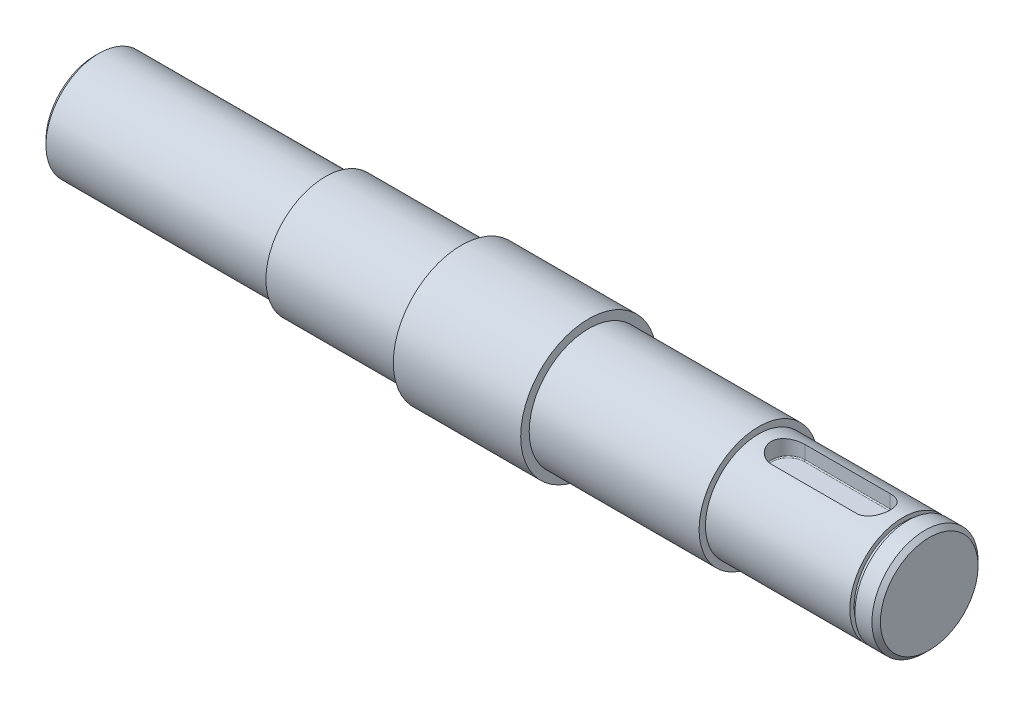
ISO-10303-21;
HEADER;
FILE_DESCRIPTION(('STEP AP214'),'2;1');
FILE_NAME('part.step','',(''),(''),'','','');
FILE_SCHEMA(('AUTOMOTIVE_DESIGN { 1 0 10303 214 1 1 1 1 }'));
ENDSEC;
DATA;
#1=APPLICATION_CONTEXT('core data for automotive mechanical design processes');
#2=APPLICATION_PROTOCOL_DEFINITION('international standard','automotive_design',2000,#1);
#3=PRODUCT_CONTEXT('',#1,'mechanical');
#4=PRODUCT('Part','Part','',(#3));
#5=PRODUCT_RELATED_PRODUCT_CATEGORY('part','',(#4));
#6=PRODUCT_DEFINITION_FORMATION('','',#4);
#7=PRODUCT_DEFINITION_CONTEXT('part definition',#1,'design');
#8=PRODUCT_DEFINITION('design','',#6,#7);
#9=PRODUCT_DEFINITION_SHAPE('','',#8);
#10=(LENGTH_UNIT() NAMED_UNIT(*) SI_UNIT(.MILLI.,.METRE.));
#11=(NAMED_UNIT(*) PLANE_ANGLE_UNIT() SI_UNIT($,.RADIAN.));
#12=(NAMED_UNIT(*) SI_UNIT($,.STERADIAN.) SOLID_ANGLE_UNIT());
#13=UNCERTAINTY_MEASURE_WITH_UNIT(LENGTH_MEASURE(1.E-05),#10,'distance_accuracy_value','');
#14=(GEOMETRIC_REPRESENTATION_CONTEXT(3) GLOBAL_UNCERTAINTY_ASSIGNED_CONTEXT((#13)) GLOBAL_UNIT_ASSIGNED_CONTEXT((#10,
#11,#12)) REPRESENTATION_CONTEXT('',''));
#15=CARTESIAN_POINT('',(0.,0.,0.));
#16=DIRECTION('',(0.,0.,1.));
#17=DIRECTION('',(1.,0.,0.));
#18=AXIS2_PLACEMENT_3D('',#15,#16,#17);
#19=CARTESIAN_POINT('',(196.,0.,0.));
#20=DIRECTION('',(-1.,0.,0.));
#21=DIRECTION('',(0.,0.,-1.));
#22=AXIS2_PLACEMENT_3D('',#19,#20,#21);
#23=CONICAL_SURFACE('',#22,12.,0.785398163397448);
#24=CARTESIAN_POINT('',(196.5,0.,0.));
#25=DIRECTION('',(1.,0.,0.));
#26=DIRECTION('',(0.,0.,1.));
#27=AXIS2_PLACEMENT_3D('',#24,#25,#26);
#28=CIRCLE('',#27,11.5);
#29=CARTESIAN_POINT('',(196.5,0.,11.5));
#30=VERTEX_POINT('',#29);
#31=EDGE_CURVE('E261',#30,#30,#28,.T.);
#32=ORIENTED_EDGE('',*,*,#31,.F.);
#33=EDGE_LOOP('',(#32));
#34=FACE_BOUND('',#33,.T.);
#35=CARTESIAN_POINT('',(195.5,0.,0.));
#36=DIRECTION('',(1.,0.,0.));
#37=DIRECTION('',(0.,0.,1.));
#38=AXIS2_PLACEMENT_3D('',#35,#36,#37);
#39=CIRCLE('',#38,12.5);
#40=CARTESIAN_POINT('',(195.5,0.,12.5));
#41=VERTEX_POINT('',#40);
#42=EDGE_CURVE('E255',#41,#41,#39,.T.);
#43=ORIENTED_EDGE('',*,*,#42,.T.);
#44=EDGE_LOOP('',(#43));
#45=FACE_BOUND('',#44,.T.);
#46=ADVANCED_FACE('F16',(#34,#45),#23,.T.);
#47=CARTESIAN_POINT('',(0.,0.,0.));
#48=DIRECTION('',(-1.,0.,0.));
#49=DIRECTION('',(0.,1.,0.));
#50=AXIS2_PLACEMENT_3D('',#47,#48,#49);
#51=PLANE('',#50);
#52=CARTESIAN_POINT('',(0.,0.,0.));
#53=DIRECTION('',(-1.,0.,0.));
#54=DIRECTION('',(0.,0.,-1.));
#55=AXIS2_PLACEMENT_3D('',#52,#53,#54);
#56=CIRCLE('',#55,11.5);
#57=CARTESIAN_POINT('',(0.,0.,-11.5));
#58=VERTEX_POINT('',#57);
#59=EDGE_CURVE('E10',#58,#58,#56,.T.);
#60=ORIENTED_EDGE('',*,*,#59,.T.);
#61=EDGE_LOOP('',(#60));
#62=FACE_BOUND('',#61,.T.);
#63=ADVANCED_FACE('F479',(#62),#51,.T.);
#64=CARTESIAN_POINT('',(0.5,0.,0.));
#65=DIRECTION('',(1.,0.,0.));
#66=DIRECTION('',(0.,0.,1.));
#67=AXIS2_PLACEMENT_3D('',#64,#65,#66);
#68=CONICAL_SURFACE('',#67,12.,0.785398163397448);
#69=CARTESIAN_POINT('',(1.,0.,0.));
#70=DIRECTION('',(-1.,0.,0.));
#71=DIRECTION('',(0.,0.,-1.));
#72=AXIS2_PLACEMENT_3D('',#69,#70,#71);
#73=CIRCLE('',#72,12.5);
#74=CARTESIAN_POINT('',(1.,0.,-12.5));
#75=VERTEX_POINT('',#74);
#76=EDGE_CURVE('E24',#75,#75,#73,.T.);
#77=ORIENTED_EDGE('',*,*,#76,.T.);
#78=EDGE_LOOP('',(#77));
#79=FACE_BOUND('',#78,.T.);
#80=ORIENTED_EDGE('',*,*,#59,.F.);
#81=EDGE_LOOP('',(#80));
#82=FACE_BOUND('',#81,.T.);
#83=ADVANCED_FACE('F470',(#79,#82),#68,.T.);
#84=CARTESIAN_POINT('',(54.3,0.,0.));
#85=DIRECTION('',(-1.,0.,0.));
#86=DIRECTION('',(0.,0.,-1.));
#87=AXIS2_PLACEMENT_3D('',#84,#85,#86);
#88=CYLINDRICAL_SURFACE('',#87,12.5);
#89=CARTESIAN_POINT('',(54.3,0.,0.));
#90=DIRECTION('',(1.,0.,0.));
#91=DIRECTION('',(0.,0.,-1.));
#92=AXIS2_PLACEMENT_3D('',#89,#90,#91);
#93=CIRCLE('',#92,12.5);
#94=CARTESIAN_POINT('',(54.3,0.,-12.5));
#95=VERTEX_POINT('',#94);
#96=EDGE_CURVE('E208',#95,#95,#93,.T.);
#97=ORIENTED_EDGE('',*,*,#96,.F.);
#98=EDGE_LOOP('',(#97));
#99=FACE_BOUND('',#98,.T.);
#100=ORIENTED_EDGE('',*,*,#76,.F.);
#101=EDGE_LOOP('',(#100));
#102=FACE_BOUND('',#101,.T.);
#103=ADVANCED_FACE('F461',(#99,#102),#88,.T.);
#104=CARTESIAN_POINT('',(54.3,0.,0.));
#105=DIRECTION('',(1.,0.,0.));
#106=DIRECTION('',(0.,0.,-1.));
#107=AXIS2_PLACEMENT_3D('',#104,#105,#106);
#108=PLANE('',#107);
#109=ORIENTED_EDGE('',*,*,#96,.T.);
#110=EDGE_LOOP('',(#109));
#111=FACE_BOUND('',#110,.T.);
#112=CARTESIAN_POINT('',(54.3,0.,0.));
#113=DIRECTION('',(1.,0.,0.));
#114=DIRECTION('',(0.,0.,1.));
#115=AXIS2_PLACEMENT_3D('',#112,#113,#114);
#116=CIRCLE('',#115,14.);
#117=CARTESIAN_POINT('',(54.3,0.,14.));
#118=VERTEX_POINT('',#117);
#119=EDGE_CURVE('E211',#118,#118,#116,.T.);
#120=ORIENTED_EDGE('',*,*,#119,.F.);
#121=EDGE_LOOP('',(#120));
#122=FACE_BOUND('',#121,.T.);
#123=ADVANCED_FACE('F452',(#111,#122),#108,.F.);
#124=CARTESIAN_POINT('',(54.3,0.,0.));
#125=DIRECTION('',(1.,0.,0.));
#126=DIRECTION('',(0.,0.,1.));
#127=AXIS2_PLACEMENT_3D('',#124,#125,#126);
#128=CYLINDRICAL_SURFACE('',#127,14.);
#129=CARTESIAN_POINT('',(86.3,0.,0.));
#130=DIRECTION('',(1.,0.,0.));
#131=DIRECTION('',(0.,0.,1.));
#132=AXIS2_PLACEMENT_3D('',#129,#130,#131);
#133=CIRCLE('',#132,14.);
#134=CARTESIAN_POINT('',(86.3,0.,14.));
#135=VERTEX_POINT('',#134);
#136=EDGE_CURVE('E258',#135,#135,#133,.T.);
#137=ORIENTED_EDGE('',*,*,#136,.F.);
#138=EDGE_LOOP('',(#137));
#139=FACE_BOUND('',#138,.T.);
#140=ORIENTED_EDGE('',*,*,#119,.T.);
#141=EDGE_LOOP('',(#140));
#142=FACE_BOUND('',#141,.T.);
#143=ADVANCED_FACE('F443',(#139,#142),#128,.T.);
#144=CARTESIAN_POINT('',(196.5,0.,0.));
#145=DIRECTION('',(1.,0.,0.));
#146=DIRECTION('',(0.,0.,-1.));
#147=AXIS2_PLACEMENT_3D('',#144,#145,#146);
#148=PLANE('',#147);
#149=ORIENTED_EDGE('',*,*,#31,.T.);
#150=EDGE_LOOP('',(#149));
#151=FACE_BOUND('',#150,.T.);
#152=ADVANCED_FACE('F434',(#151),#148,.T.);
#153=CARTESIAN_POINT('',(86.3,0.,0.));
#154=DIRECTION('',(1.,0.,0.));
#155=DIRECTION('',(0.,0.,-1.));
#156=AXIS2_PLACEMENT_3D('',#153,#154,#155);
#157=PLANE('',#156);
#158=ORIENTED_EDGE('',*,*,#136,.T.);
#159=EDGE_LOOP('',(#158));
#160=FACE_BOUND('',#159,.T.);
#161=CARTESIAN_POINT('',(86.3,0.,0.));
#162=DIRECTION('',(1.,0.,0.));
#163=DIRECTION('',(0.,0.,1.));
#164=AXIS2_PLACEMENT_3D('',#161,#162,#163);
#165=CIRCLE('',#164,16.);
#166=CARTESIAN_POINT('',(86.3,0.,16.));
#167=VERTEX_POINT('',#166);
#168=EDGE_CURVE('E252',#167,#167,#165,.T.);
#169=ORIENTED_EDGE('',*,*,#168,.F.);
#170=EDGE_LOOP('',(#169));
#171=FACE_BOUND('',#170,.T.);
#172=ADVANCED_FACE('F425',(#160,#171),#157,.F.);
#173=CARTESIAN_POINT('',(191.5,0.,0.));
#174=DIRECTION('',(1.,0.,0.));
#175=DIRECTION('',(0.,0.,1.));
#176=AXIS2_PLACEMENT_3D('',#173,#174,#175);
#177=CYLINDRICAL_SURFACE('',#176,12.5);
#178=ORIENTED_EDGE('',*,*,#42,.F.);
#179=EDGE_LOOP('',(#178));
#180=FACE_BOUND('',#179,.T.);
#181=CARTESIAN_POINT('',(191.5,0.,0.));
#182=DIRECTION('',(1.,0.,0.));
#183=DIRECTION('',(0.,0.,1.));
#184=AXIS2_PLACEMENT_3D('',#181,#182,#183);
#185=CIRCLE('',#184,12.5);
#186=CARTESIAN_POINT('',(191.5,0.,12.5));
#187=VERTEX_POINT('',#186);
#188=EDGE_CURVE('E249',#187,#187,#185,.T.);
#189=ORIENTED_EDGE('',*,*,#188,.T.);
#190=EDGE_LOOP('',(#189));
#191=FACE_BOUND('',#190,.T.);
#192=ADVANCED_FACE('F416',(#180,#191),#177,.T.);
#193=CARTESIAN_POINT('',(86.3,0.,0.));
#194=DIRECTION('',(1.,0.,0.));
#195=DIRECTION('',(0.,0.,1.));
#196=AXIS2_PLACEMENT_3D('',#193,#194,#195);
#197=CYLINDRICAL_SURFACE('',#196,16.);
#198=CARTESIAN_POINT('',(116.3,0.,0.));
#199=DIRECTION('',(1.,0.,0.));
#200=DIRECTION('',(0.,0.,1.));
#201=AXIS2_PLACEMENT_3D('',#198,#199,#200);
#202=CIRCLE('',#201,16.);
#203=CARTESIAN_POINT('',(116.3,0.,16.));
#204=VERTEX_POINT('',#203);
#205=EDGE_CURVE('E246',#204,#204,#202,.T.);
#206=ORIENTED_EDGE('',*,*,#205,.F.);
#207=EDGE_LOOP('',(#206));
#208=FACE_BOUND('',#207,.T.);
#209=ORIENTED_EDGE('',*,*,#168,.T.);
#210=EDGE_LOOP('',(#209));
#211=FACE_BOUND('',#210,.T.);
#212=ADVANCED_FACE('F407',(#208,#211),#197,.T.);
#213=CARTESIAN_POINT('',(191.5,0.,0.));
#214=DIRECTION('',(1.,0.,0.));
#215=DIRECTION('',(0.,0.,-1.));
#216=AXIS2_PLACEMENT_3D('',#213,#214,#215);
#217=PLANE('',#216);
#218=CARTESIAN_POINT('',(191.5,0.,0.));
#219=DIRECTION('',(1.,0.,0.));
#220=DIRECTION('',(0.,0.,1.));
#221=AXIS2_PLACEMENT_3D('',#218,#219,#220);
#222=CIRCLE('',#221,11.5);
#223=CARTESIAN_POINT('',(191.5,0.,11.5));
#224=VERTEX_POINT('',#223);
#225=EDGE_CURVE('E225',#224,#224,#222,.T.);
#226=ORIENTED_EDGE('',*,*,#225,.T.);
#227=EDGE_LOOP('',(#226));
#228=FACE_BOUND('',#227,.T.);
#229=ORIENTED_EDGE('',*,*,#188,.F.);
#230=EDGE_LOOP('',(#229));
#231=FACE_BOUND('',#230,.T.);
#232=ADVANCED_FACE('F398',(#228,#231),#217,.F.);
#233=CARTESIAN_POINT('',(116.3,0.,0.));
#234=DIRECTION('',(1.,0.,0.));
#235=DIRECTION('',(0.,0.,-1.));
#236=AXIS2_PLACEMENT_3D('',#233,#234,#235);
#237=PLANE('',#236);
#238=CARTESIAN_POINT('',(116.3,0.,0.));
#239=DIRECTION('',(1.,0.,0.));
#240=DIRECTION('',(0.,0.,1.));
#241=AXIS2_PLACEMENT_3D('',#238,#239,#240);
#242=CIRCLE('',#241,14.);
#243=CARTESIAN_POINT('',(116.3,0.,14.));
#244=VERTEX_POINT('',#243);
#245=EDGE_CURVE('E222',#244,#244,#242,.T.);
#246=ORIENTED_EDGE('',*,*,#245,.F.);
#247=EDGE_LOOP('',(#246));
#248=FACE_BOUND('',#247,.T.);
#249=ORIENTED_EDGE('',*,*,#205,.T.);
#250=EDGE_LOOP('',(#249));
#251=FACE_BOUND('',#250,.T.);
#252=ADVANCED_FACE('F360',(#248,#251),#237,.T.);
#253=CARTESIAN_POINT('',(190.3,0.,0.));
#254=DIRECTION('',(1.,0.,0.));
#255=DIRECTION('',(0.,0.,1.));
#256=AXIS2_PLACEMENT_3D('',#253,#254,#255);
#257=CYLINDRICAL_SURFACE('',#256,11.5);
#258=ORIENTED_EDGE('',*,*,#225,.F.);
#259=EDGE_LOOP('',(#258));
#260=FACE_BOUND('',#259,.T.);
#261=CARTESIAN_POINT('',(190.3,0.,0.));
#262=DIRECTION('',(1.,0.,0.));
#263=DIRECTION('',(0.,0.,1.));
#264=AXIS2_PLACEMENT_3D('',#261,#262,#263);
#265=CIRCLE('',#264,11.5);
#266=CARTESIAN_POINT('',(190.3,0.,11.5));
#267=VERTEX_POINT('',#266);
#268=EDGE_CURVE('E226',#267,#267,#265,.T.);
#269=ORIENTED_EDGE('',*,*,#268,.T.);
#270=EDGE_LOOP('',(#269));
#271=FACE_BOUND('',#270,.T.);
#272=ADVANCED_FACE('F355',(#260,#271),#257,.T.);
#273=CARTESIAN_POINT('',(116.3,0.,0.));
#274=DIRECTION('',(1.,0.,0.));
#275=DIRECTION('',(0.,0.,1.));
#276=AXIS2_PLACEMENT_3D('',#273,#274,#275);
#277=CYLINDRICAL_SURFACE('',#276,14.);
#278=CARTESIAN_POINT('',(156.3,0.,0.));
#279=DIRECTION('',(1.,0.,0.));
#280=DIRECTION('',(0.,0.,1.));
#281=AXIS2_PLACEMENT_3D('',#278,#279,#280);
#282=CIRCLE('',#281,14.);
#283=CARTESIAN_POINT('',(156.3,0.,14.));
#284=VERTEX_POINT('',#283);
#285=EDGE_CURVE('E239',#284,#284,#282,.T.);
#286=ORIENTED_EDGE('',*,*,#285,.F.);
#287=EDGE_LOOP('',(#286));
#288=FACE_BOUND('',#287,.T.);
#289=ORIENTED_EDGE('',*,*,#245,.T.);
#290=EDGE_LOOP('',(#289));
#291=FACE_BOUND('',#290,.T.);
#292=ADVANCED_FACE('F325',(#288,#291),#277,.T.);
#293=CARTESIAN_POINT('',(163.3,14.5,0.));
#294=DIRECTION('',(0.,-1.,0.));
#295=DIRECTION('',(0.,0.,1.));
#296=AXIS2_PLACEMENT_3D('',#293,#294,#295);
#297=CYLINDRICAL_SURFACE('',#296,4.);
#298=CARTESIAN_POINT('',(163.3,11.8427192858859,4.));
#299=CARTESIAN_POINT('',(163.284892466756,11.8427192752621,4.00000000660021));
#300=CARTESIAN_POINT('',(163.254212249326,11.842777996675,3.9998261785867));
#301=CARTESIAN_POINT('',(163.207493473476,11.8430489331777,3.99902392736785));
#302=CARTESIAN_POINT('',(163.158911811704,11.8435251742866,3.99761335533497));
#303=CARTESIAN_POINT('',(163.108471710308,11.8442304856701,3.99552329848311));
#304=CARTESIAN_POINT('',(163.05527085542,11.8452061140425,3.99263022749253));
#305=CARTESIAN_POINT('',(162.99934581795,11.8464881791008,3.98882498307457));
#306=CARTESIAN_POINT('',(162.939828209384,11.8481425176702,3.9839088861287));
#307=CARTESIAN_POINT('',(162.877693963482,11.8501895947723,3.97781640996389));
#308=CARTESIAN_POINT('',(162.812075378895,11.852703516797,3.97032039658099));
#309=CARTESIAN_POINT('',(162.742975027474,11.8557401898192,3.96124496184573));
#310=CARTESIAN_POINT('',(162.668550626589,11.8594588136524,3.95010022951008));
#311=CARTESIAN_POINT('',(162.589739078941,11.8639060675799,3.93672608047436));
#312=CARTESIAN_POINT('',(162.505724072297,11.8692217159966,3.92067426343487));
#313=CARTESIAN_POINT('',(162.417585169864,11.8754334863806,3.90182449436319));
#314=CARTESIAN_POINT('',(162.324583083993,11.8826955632336,3.87965910663391));
#315=CARTESIAN_POINT('',(162.228608353377,11.8909515068504,3.85428889686126));
#316=CARTESIAN_POINT('',(162.125416748823,11.9006688726898,3.82419473916238));
#317=CARTESIAN_POINT('',(162.011900864232,11.912361661601,3.78764494253445));
#318=CARTESIAN_POINT('',(161.879302537444,11.9273534219398,3.74022440541349));
#319=CARTESIAN_POINT('',(161.729407026826,11.9460589826312,3.68013140989384));
#320=CARTESIAN_POINT('',(161.53573252434,11.9727862259489,3.59251445457917));
#321=CARTESIAN_POINT('',(161.311825439645,12.0076032040654,3.47489008872733));
#322=CARTESIAN_POINT('',(161.06756852221,12.0505397477586,3.32320090947642));
#323=CARTESIAN_POINT('',(160.86480221771,12.0900539464116,3.17616924328629));
#324=CARTESIAN_POINT('',(160.70312435576,12.1238788743454,3.04399595699051));
#325=CARTESIAN_POINT('',(160.585170312725,12.149755874987,2.93888301933396));
#326=CARTESIAN_POINT('',(160.485427483789,12.1724811326278,2.84314557943963));
#327=CARTESIAN_POINT('',(160.402861414864,12.1918658532214,2.75874255753679));
#328=CARTESIAN_POINT('',(160.330041197925,12.2093900654748,2.68007073123343));
#329=CARTESIAN_POINT('',(160.263954147601,12.2256401500441,2.60493571203151));
#330=CARTESIAN_POINT('',(160.201272223952,12.241362703419,2.53001351594598));
#331=CARTESIAN_POINT('',(160.142160972386,12.256464343019,2.45580549797962));
#332=CARTESIAN_POINT('',(160.085936646302,12.2710746679386,2.38172496693647));
#333=CARTESIAN_POINT('',(160.032645351703,12.2851441846673,2.30805286206816));
#334=CARTESIAN_POINT('',(159.982022040378,12.2987085394487,2.23463703708557));
#335=CARTESIAN_POINT('',(159.929374890022,12.3130101564768,2.15457377825303));
#336=CARTESIAN_POINT('',(159.87519928686,12.3279464164696,2.06755670675723));
#337=CARTESIAN_POINT('',(159.820197819244,12.3433447429019,1.97353447948222));
#338=CARTESIAN_POINT('',(159.773289947215,12.3566627451695,1.88815769454465));
#339=CARTESIAN_POINT('',(159.733335175994,12.3681336116315,1.81131592893122));
#340=CARTESIAN_POINT('',(159.699404971463,12.3779622471653,1.74288428722177));
#341=CARTESIAN_POINT('',(159.6670400184,12.3874168001104,1.67436451945004));
#342=CARTESIAN_POINT('',(159.636263853849,12.3964788789652,1.60589579335905));
#343=CARTESIAN_POINT('',(159.606958149926,12.4051727267374,1.53729733703149));
#344=CARTESIAN_POINT('',(159.578020893908,12.4138179898951,1.46591893637077));
#345=CARTESIAN_POINT('',(159.548534751305,12.4226895624473,1.38888828448686));
#346=CARTESIAN_POINT('',(159.517007446065,12.4322449563189,1.30086299545673));
#347=CARTESIAN_POINT('',(159.484216202054,12.4422612968341,1.2016362301614));
#348=CARTESIAN_POINT('',(159.451137385848,12.4524464911315,1.0913230929822));
#349=CARTESIAN_POINT('',(159.420088320964,12.4620803817568,0.975334923046085));
#350=CARTESIAN_POINT('',(159.390477329963,12.4713320730924,0.849417097911197));
#351=CARTESIAN_POINT('',(159.36492992649,12.4793672187247,0.721954193939012));
#352=CARTESIAN_POINT('',(159.344544940332,12.4858134897378,0.599010476986652));
#353=CARTESIAN_POINT('',(159.331277917536,12.490024945918,0.501697218336813));
#354=CARTESIAN_POINT('',(159.322421245672,12.4928427174447,0.424518080983753));
#355=CARTESIAN_POINT('',(159.316261344746,12.4948054939283,0.362091034234707));
#356=CARTESIAN_POINT('',(159.31118806648,12.4964240692941,0.300991135102319));
#357=CARTESIAN_POINT('',(159.307146176634,12.4977149076161,0.241415904567368));
#358=CARTESIAN_POINT('',(159.304036851482,12.4987087096093,0.182774470852502));
#359=CARTESIAN_POINT('',(159.301745996088,12.4994413495439,0.123193172201231));
#360=CARTESIAN_POINT('',(159.300323111578,12.4998965988717,0.0622971889286505));
#361=CARTESIAN_POINT('',(159.299986632885,12.5000042774489,0.0190073821308843));
#362=CARTESIAN_POINT('',(159.300017627936,12.4999943591438,-0.0290538366999472));
#363=CARTESIAN_POINT('',(159.300611377066,12.499804345621,-0.0835474518488583));
#364=CARTESIAN_POINT('',(159.303398555554,12.4989127082237,-0.174349819962573));
#365=CARTESIAN_POINT('',(159.308983654857,12.4971274309324,-0.27552682237082));
#366=CARTESIAN_POINT('',(159.317954345777,12.4942649647029,-0.383415945096935));
#367=CARTESIAN_POINT('',(159.327920947617,12.4910920373344,-0.474259392613105));
#368=CARTESIAN_POINT('',(159.337635040539,12.4880068363431,-0.54855802561309));
#369=CARTESIAN_POINT('',(159.346197166626,12.4852927227441,-0.607060230835405));
#370=CARTESIAN_POINT('',(159.355156785202,12.4824582116473,-0.662740582128897));
#371=CARTESIAN_POINT('',(159.364915144854,12.4793774301058,-0.718476246994006));
#372=CARTESIAN_POINT('',(159.375979294695,12.4758926034321,-0.776731340873855));
#373=CARTESIAN_POINT('',(159.388867442942,12.4718443075685,-0.839345925495779));
#374=CARTESIAN_POINT('',(159.403709353992,12.4671971144693,-0.905862854158762));
#375=CARTESIAN_POINT('',(159.423457094917,12.4610366875257,-0.987542528589665));
#376=CARTESIAN_POINT('',(159.449260674908,12.4530279731438,-1.08451458418038));
#377=CARTESIAN_POINT('',(159.48294090577,12.4426500050685,-1.19792983905691));
#378=CARTESIAN_POINT('',(159.519114355269,12.4315996300285,-1.30737731502847));
#379=CARTESIAN_POINT('',(159.556837683888,12.4201797272635,-1.41148031393508));
#380=CARTESIAN_POINT('',(159.595089726379,12.4087014317319,-1.50911343603032));
#381=CARTESIAN_POINT('',(159.636923132369,12.3962716499521,-1.60804660624065));
#382=CARTESIAN_POINT('',(159.682064323075,12.3830043603179,-1.70719517092053));
#383=CARTESIAN_POINT('',(159.729888888516,12.3691130187255,-1.80506312765269));
#384=CARTESIAN_POINT('',(159.779863543443,12.3547790658151,-1.90064962239504));
#385=CARTESIAN_POINT('',(159.831577106813,12.3401424105648,-1.99342055947352));
#386=CARTESIAN_POINT('',(159.889726890639,12.3239115833508,-2.09158124031287));
#387=CARTESIAN_POINT('',(159.954775769275,12.3060532753542,-2.19434103684966));
#388=CARTESIAN_POINT('',(160.027005734775,12.2866124148119,-2.30062232253015));
#389=CARTESIAN_POINT('',(160.094685734212,12.26876963804,-2.39372226197031));
#390=CARTESIAN_POINT('',(160.157357183993,12.2525589515004,-2.47519705833708));
#391=CARTESIAN_POINT('',(160.215014569743,12.237894747636,-2.54669935387715));
#392=CARTESIAN_POINT('',(160.274510026335,12.2230292834304,-2.61710914779064));
#393=CARTESIAN_POINT('',(160.343780509586,12.2060432322161,-2.69534519365332));
#394=CARTESIAN_POINT('',(160.424209921782,12.1867795149854,-2.78127234019984));
#395=CARTESIAN_POINT('',(160.517350495478,12.1651238647946,-2.87450762856061));
#396=CARTESIAN_POINT('',(160.610899040896,12.1440714915068,-2.96210544028574));
#397=CARTESIAN_POINT('',(160.707217859563,12.1231040920882,-3.04674852974405));
#398=CARTESIAN_POINT('',(160.81249271574,12.1009725462022,-3.13359583908224));
#399=CARTESIAN_POINT('',(160.935726405192,12.0761746812981,-3.22792398348043));
#400=CARTESIAN_POINT('',(161.078109710028,12.0490464532734,-3.3277800196934));
#401=CARTESIAN_POINT('',(161.233015339194,12.0213977299774,-3.42628236861393));
#402=CARTESIAN_POINT('',(161.393357324687,11.9948679532875,-3.51793686202128));
#403=CARTESIAN_POINT('',(161.550746852031,11.9708883114171,-3.59858956657523));
#404=CARTESIAN_POINT('',(161.696208004798,11.9505566384431,-3.66545006400631));
#405=CARTESIAN_POINT('',(161.828022284796,11.9336406771165,-3.72009036228427));
#406=CARTESIAN_POINT('',(161.944740461464,11.9198437629818,-3.76402748881942));
#407=CARTESIAN_POINT('',(162.053689077377,11.9079666578939,-3.80141592066341));
#408=CARTESIAN_POINT('',(162.158435725327,11.8974595450018,-3.83416399303405));
#409=CARTESIAN_POINT('',(162.263184116877,11.8878663641276,-3.86379645996945));
#410=CARTESIAN_POINT('',(162.367681365248,11.8792089365433,-3.89032459690038));
#411=CARTESIAN_POINT('',(162.472117046289,11.8714692269176,-3.91387247183114));
#412=CARTESIAN_POINT('',(162.576354126293,11.8646557097493,-3.93447331367671));
#413=CARTESIAN_POINT('',(162.680552759969,11.8587568388097,-3.95221257903597));
#414=CARTESIAN_POINT('',(162.784480095539,11.8537830881747,-3.96710138909897));
#415=CARTESIAN_POINT('',(162.888210259368,11.8497258213912,-3.97920092709287));
#416=CARTESIAN_POINT('',(162.991548045442,11.8465858015131,-3.98853708913173));
#417=CARTESIAN_POINT('',(163.094605834538,11.8443515099887,-3.99516542506536));
#418=CARTESIAN_POINT('',(163.197349334327,11.8430159868525,-3.99912192777));
#419=CARTESIAN_POINT('',(163.265812567557,11.8427190883927,-4.00000011335332));
#420=CARTESIAN_POINT('',(163.3,11.842719282327,-4.));
#421=(BOUNDED_CURVE() B_SPLINE_CURVE(3,(#298,#299,#300,#301,#302,#303,#304,#305,#306,#307,#308,
#309,#310,#311,#312,#313,#314,#315,#316,#317,#318,#319,#320,#321,#322,#323,#324,#325,#326,#327,
#328,#329,#330,#331,#332,#333,#334,#335,#336,#337,#338,#339,#340,#341,#342,#343,#344,#345,#346,
#347,#348,#349,#350,#351,#352,#353,#354,#355,#356,#357,#358,#359,#360,#361,#362,#363,#364,#365,
#366,#367,#368,#369,#370,#371,#372,#373,#374,#375,#376,#377,#378,#379,#380,#381,#382,#383,#384,
#385,#386,#387,#388,#389,#390,#391,#392,#393,#394,#395,#396,#397,#398,#399,#400,#401,#402,#403,
#404,#405,#406,#407,#408,#409,#410,#411,#412,#413,#414,#415,#416,#417,#418,#419,#420),
.UNSPECIFIED.,.F.,.F.) B_SPLINE_CURVE_WITH_KNOTS((4,1,1,1,1,1,1,1,1,1,1,1,1,1,1,1,1,1,1,1,1,1,1,
1,1,1,1,1,1,1,1,1,1,1,1,1,1,1,1,1,1,1,1,1,1,1,1,1,1,1,1,1,1,1,1,1,1,1,1,1,1,1,1,1,1,1,1,1,1,1,1,
1,1,1,1,1,1,1,1,1,1,1,1,1,1,1,1,1,1,1,1,1,1,1,1,1,1,1,1,1,1,1,1,1,1,1,1,1,1,1,1,1,1,1,1,1,1,1,1,
1,4),(-1.,-0.996416806723238,-0.992723178682151,-0.98891724922133,-0.984888475164703,
-0.980747972035005,-0.976277932916545,-0.971589939198842,-0.966578585417241,-0.961463809246652,
-0.955916912748039,-0.950037284168518,-0.943598892187368,-0.936934542299673,-0.929718264395347,
-0.922178328282535,-0.914200899040318,-0.906099005174438,-0.89658576585964,-0.88578684207151,
-0.872518800699813,-0.858041191126524,-0.834996106839283,-0.81201580666316,-0.789138166061545,
-0.774902433967831,-0.76186159622666,-0.751180432165615,-0.741681232080627,-0.733489652790802,
-0.725422663365073,-0.717642206390016,-0.710027233536424,-0.702641802795339,-0.695318334601455,
-0.688209592242238,-0.681252300772774,-0.672344757064431,-0.663647538943654,-0.655166602559425,
-0.649031182424169,-0.642931235336062,-0.636905854436568,-0.630923561463704,-0.625002391347678,
-0.619098179530097,-0.612545691198957,-0.605331584708232,-0.596811593583253,-0.587652069820478,
-0.577917178114499,-0.568249404069929,-0.556903044205923,-0.547038796903136,-0.538667976074738,
-0.53360081746199,-0.528610883285063,-0.523789798322601,-0.519060776579132,-0.514450437046936,
-0.509863692782873,-0.504920211037661,-0.500004033852231,-0.499596131867822,-0.493520787147744,
-0.487078539226003,-0.478049219303635,-0.469488169866051,-0.461402107351649,-0.456370870684717,
-0.451708827996779,-0.447369956784102,-0.442983100385895,-0.438273109047096,-0.43328609344529,
-0.427794719032216,-0.422075390685356,-0.413306702566985,-0.403926082446106,-0.39391572786971,
-0.38585095187059,-0.377532685853802,-0.36890470602601,-0.360212746147743,-0.351510924053647,
-0.342867472858234,-0.334412493694012,-0.326088775414318,-0.31554166583765,-0.305266508708352,
-0.295272828091716,-0.287923973606101,-0.280591140139311,-0.273216373432415,-0.265783107958757,
-0.255486932747533,-0.244937193644836,-0.234114930189001,-0.224691252416165,-0.214128485145462,
-0.20133280473869,-0.187430109941865,-0.172400329170307,-0.15732155084092,-0.143191825982805,
-0.130085055881567,-0.119062492428957,-0.10912619379928,-0.100337879335827,-0.0916088801883773,
-0.0829869120752422,-0.0744255597866562,-0.0659591823250092,-0.057527806435469,
-0.0491666942802766,-0.0408423227307032,-0.0325904581698958,-0.0243727757550981,
-0.0162209324968542,-0.00809757763244687,0.),
.UNSPECIFIED.) CURVE() GEOMETRIC_REPRESENTATION_ITEM() RATIONAL_B_SPLINE_CURVE((1.,1.,1.,1.,1.,
1.,1.,1.,1.,1.,1.,1.,1.,1.,1.,1.,1.,1.,1.,1.,1.,1.,1.,1.,1.,1.,1.,1.,1.,1.,1.,1.,1.,1.,1.,1.,1.,
1.,1.,1.,1.,1.,1.,1.,1.,1.,1.,1.,1.,1.,1.,1.,1.,1.,1.,1.,1.,1.,1.,1.,1.,1.,1.,1.,1.,1.,1.,1.,1.,
1.,1.,1.,1.,1.,1.,1.,1.,1.,1.,1.,1.,1.,1.,1.,1.,1.,1.,1.,1.,1.,1.,1.,1.,1.,1.,1.,1.,1.,1.,1.,1.,
1.,1.,1.,1.,1.,1.,1.,1.,1.,1.,1.,1.,1.,1.,1.,1.,1.,1.,1.,1.,1.,1.)) REPRESENTATION_ITEM(''));
#422=CARTESIAN_POINT('',(163.3,11.842719282327,4.));
#423=VERTEX_POINT('',#422);
#424=CARTESIAN_POINT('',(163.3,11.842719282327,-4.));
#425=VERTEX_POINT('',#424);
#426=EDGE_CURVE('E167',#423,#425,#421,.T.);
#427=ORIENTED_EDGE('',*,*,#426,.F.);
#428=DIRECTION('',(0.,1.,0.));
#429=VECTOR('',#428,1.);
#430=CARTESIAN_POINT('',(163.3,11.842719282327,4.));
#431=LINE('',#430,#429);
#432=CARTESIAN_POINT('',(163.3,8.75,4.));
#433=VERTEX_POINT('',#432);
#434=EDGE_CURVE('E199',#433,#423,#431,.T.);
#435=ORIENTED_EDGE('',*,*,#434,.F.);
#436=CARTESIAN_POINT('',(163.3,8.75,0.));
#437=DIRECTION('',(0.,-1.,0.));
#438=DIRECTION('',(0.,0.,1.));
#439=AXIS2_PLACEMENT_3D('',#436,#437,#438);
#440=CIRCLE('',#439,4.);
#441=CARTESIAN_POINT('',(163.3,8.75,-4.));
#442=VERTEX_POINT('',#441);
#443=EDGE_CURVE('E236',#433,#442,#440,.T.);
#444=ORIENTED_EDGE('',*,*,#443,.T.);
#445=DIRECTION('',(0.,-1.,0.));
#446=VECTOR('',#445,1.);
#447=CARTESIAN_POINT('',(163.3,11.842719282327,-4.));
#448=LINE('',#447,#446);
#449=EDGE_CURVE('E158',#425,#442,#448,.T.);
#450=ORIENTED_EDGE('',*,*,#449,.F.);
#451=EDGE_LOOP('',(#427,#435,#444,#450));
#452=FACE_BOUND('',#451,.T.);
#453=ADVANCED_FACE('F320',(#452),#297,.F.);
#454=CARTESIAN_POINT('',(190.3,0.,0.));
#455=DIRECTION('',(1.,0.,0.));
#456=DIRECTION('',(0.,0.,-1.));
#457=AXIS2_PLACEMENT_3D('',#454,#455,#456);
#458=PLANE('',#457);
#459=ORIENTED_EDGE('',*,*,#268,.F.);
#460=EDGE_LOOP('',(#459));
#461=FACE_BOUND('',#460,.T.);
#462=CARTESIAN_POINT('',(190.3,0.,0.));
#463=DIRECTION('',(1.,0.,0.));
#464=DIRECTION('',(0.,0.,1.));
#465=AXIS2_PLACEMENT_3D('',#462,#463,#464);
#466=CIRCLE('',#465,12.5);
#467=CARTESIAN_POINT('',(190.3,0.,12.5));
#468=VERTEX_POINT('',#467);
#469=EDGE_CURVE('E176',#468,#468,#466,.T.);
#470=ORIENTED_EDGE('',*,*,#469,.T.);
#471=EDGE_LOOP('',(#470));
#472=FACE_BOUND('',#471,.T.);
#473=ADVANCED_FACE('F278',(#461,#472),#458,.T.);
#474=CARTESIAN_POINT('',(156.3,0.,0.));
#475=DIRECTION('',(1.,0.,0.));
#476=DIRECTION('',(0.,0.,-1.));
#477=AXIS2_PLACEMENT_3D('',#474,#475,#476);
#478=PLANE('',#477);
#479=CARTESIAN_POINT('',(156.3,0.,0.));
#480=DIRECTION('',(1.,0.,0.));
#481=DIRECTION('',(0.,0.,1.));
#482=AXIS2_PLACEMENT_3D('',#479,#480,#481);
#483=CIRCLE('',#482,12.5);
#484=CARTESIAN_POINT('',(156.3,0.,12.5));
#485=VERTEX_POINT('',#484);
#486=EDGE_CURVE('E184',#485,#485,#483,.T.);
#487=ORIENTED_EDGE('',*,*,#486,.F.);
#488=EDGE_LOOP('',(#487));
#489=FACE_BOUND('',#488,.T.);
#490=ORIENTED_EDGE('',*,*,#285,.T.);
#491=EDGE_LOOP('',(#490));
#492=FACE_BOUND('',#491,.T.);
#493=ADVANCED_FACE('F272',(#489,#492),#478,.T.);
#494=CARTESIAN_POINT('',(163.3,8.75,0.));
#495=DIRECTION('',(0.,-1.,0.));
#496=DIRECTION('',(0.,0.,1.));
#497=AXIS2_PLACEMENT_3D('',#494,#495,#496);
#498=TOROIDAL_SURFACE('',#497,3.75,0.25);
#499=CARTESIAN_POINT('',(163.3,8.75,3.75));
#500=DIRECTION('',(-1.,0.,0.));
#501=DIRECTION('',(0.,-1.,0.));
#502=AXIS2_PLACEMENT_3D('',#499,#500,#501);
#503=CIRCLE('',#502,0.25);
#504=CARTESIAN_POINT('',(163.3,8.5,3.75));
#505=VERTEX_POINT('',#504);
#506=EDGE_CURVE('E229',#505,#433,#503,.T.);
#507=ORIENTED_EDGE('',*,*,#506,.F.);
#508=CARTESIAN_POINT('',(163.3,8.5,0.));
#509=DIRECTION('',(0.,-1.,0.));
#510=DIRECTION('',(0.,0.,1.));
#511=AXIS2_PLACEMENT_3D('',#508,#509,#510);
#512=CIRCLE('',#511,3.75);
#513=CARTESIAN_POINT('',(163.3,8.5,-3.75));
#514=VERTEX_POINT('',#513);
#515=EDGE_CURVE('E562',#505,#514,#512,.T.);
#516=ORIENTED_EDGE('',*,*,#515,.T.);
#517=CARTESIAN_POINT('',(163.3,8.75,-3.75));
#518=DIRECTION('',(-1.,0.,0.));
#519=DIRECTION('',(0.,0.,-1.));
#520=AXIS2_PLACEMENT_3D('',#517,#518,#519);
#521=CIRCLE('',#520,0.25);
#522=EDGE_CURVE('E218',#442,#514,#521,.T.);
#523=ORIENTED_EDGE('',*,*,#522,.F.);
#524=ORIENTED_EDGE('',*,*,#443,.F.);
#525=EDGE_LOOP('',(#507,#516,#523,#524));
#526=FACE_BOUND('',#525,.T.);
#527=ADVANCED_FACE('F277',(#526),#498,.F.);
#528=CARTESIAN_POINT('',(183.3,8.75,0.));
#529=DIRECTION('',(0.,-1.,0.));
#530=DIRECTION('',(0.,0.,-1.));
#531=AXIS2_PLACEMENT_3D('',#528,#529,#530);
#532=TOROIDAL_SURFACE('',#531,3.75,0.25);
#533=CARTESIAN_POINT('',(183.3,8.75,-3.75));
#534=DIRECTION('',(1.,0.,0.));
#535=DIRECTION('',(0.,0.,-1.));
#536=AXIS2_PLACEMENT_3D('',#533,#534,#535);
#537=CIRCLE('',#536,0.25);
#538=CARTESIAN_POINT('',(183.3,8.5,-3.75));
#539=VERTEX_POINT('',#538);
#540=CARTESIAN_POINT('',(183.3,8.75,-4.));
#541=VERTEX_POINT('',#540);
#542=EDGE_CURVE('E201',#539,#541,#537,.T.);
#543=ORIENTED_EDGE('',*,*,#542,.F.);
#544=CARTESIAN_POINT('',(183.3,8.5,0.));
#545=DIRECTION('',(0.,-1.,0.));
#546=DIRECTION('',(0.,0.,-1.));
#547=AXIS2_PLACEMENT_3D('',#544,#545,#546);
#548=CIRCLE('',#547,3.75);
#549=CARTESIAN_POINT('',(183.3,8.5,3.75));
#550=VERTEX_POINT('',#549);
#551=EDGE_CURVE('E551',#539,#550,#548,.T.);
#552=ORIENTED_EDGE('',*,*,#551,.T.);
#553=CARTESIAN_POINT('',(183.3,8.75,3.75));
#554=DIRECTION('',(1.,0.,0.));
#555=DIRECTION('',(0.,-1.,0.));
#556=AXIS2_PLACEMENT_3D('',#553,#554,#555);
#557=CIRCLE('',#556,0.25);
#558=CARTESIAN_POINT('',(183.3,8.75,4.));
#559=VERTEX_POINT('',#558);
#560=EDGE_CURVE('E221',#559,#550,#557,.T.);
#561=ORIENTED_EDGE('',*,*,#560,.F.);
#562=CARTESIAN_POINT('',(183.3,8.75,0.));
#563=DIRECTION('',(0.,-1.,0.));
#564=DIRECTION('',(0.,0.,-1.));
#565=AXIS2_PLACEMENT_3D('',#562,#563,#564);
#566=CIRCLE('',#565,4.);
#567=EDGE_CURVE('E233',#541,#559,#566,.T.);
#568=ORIENTED_EDGE('',*,*,#567,.F.);
#569=EDGE_LOOP('',(#543,#552,#561,#568));
#570=FACE_BOUND('',#569,.T.);
#571=ADVANCED_FACE('F369',(#570),#532,.F.);
#572=CARTESIAN_POINT('',(183.3,14.5,0.));
#573=DIRECTION('',(0.,-1.,0.));
#574=DIRECTION('',(0.,0.,-1.));
#575=AXIS2_PLACEMENT_3D('',#572,#573,#574);
#576=CYLINDRICAL_SURFACE('',#575,4.);
#577=DIRECTION('',(0.,-1.,0.));
#578=VECTOR('',#577,1.);
#579=CARTESIAN_POINT('',(183.3,11.842719282327,4.));
#580=LINE('',#579,#578);
#581=CARTESIAN_POINT('',(183.3,11.842719282327,4.));
#582=VERTEX_POINT('',#581);
#583=EDGE_CURVE('E172',#582,#559,#580,.T.);
#584=ORIENTED_EDGE('',*,*,#583,.F.);
#585=CARTESIAN_POINT('',(183.3,11.842719282327,-4.));
#586=CARTESIAN_POINT('',(183.366572983291,11.8427173227488,-4.00000104534462));
#587=CARTESIAN_POINT('',(183.486268506137,11.8437310116686,-3.99700857689943));
#588=CARTESIAN_POINT('',(183.645310451096,11.8474797296652,-3.98588517979788));
#589=CARTESIAN_POINT('',(183.777374934603,11.8521390178484,-3.97201160027343));
#590=CARTESIAN_POINT('',(183.909142904176,11.8581052195118,-3.95417463157939));
#591=CARTESIAN_POINT('',(184.053402625101,11.8663156589182,-3.92948913586726));
#592=CARTESIAN_POINT('',(184.209505493503,11.8772557773666,-3.89631599402345));
#593=CARTESIAN_POINT('',(184.351175353217,11.8890267744304,-3.86025351695423));
#594=CARTESIAN_POINT('',(184.478659990866,11.9010475141432,-3.82302546643112));
#595=CARTESIAN_POINT('',(184.592280415661,11.9128410718132,-3.78612769965208));
#596=CARTESIAN_POINT('',(184.704635220425,11.9255566442499,-3.74589645972202));
#597=CARTESIAN_POINT('',(184.819800992469,11.939653918931,-3.70074230193728));
#598=CARTESIAN_POINT('',(184.941592007298,11.9557327102379,-3.64851130975935));
#599=CARTESIAN_POINT('',(185.077021406033,11.9750247380446,-3.58476729026091));
#600=CARTESIAN_POINT('',(185.224665188575,11.9977715701539,-3.50800185449273));
#601=CARTESIAN_POINT('',(185.382467741928,12.0240726857603,-3.416885765032));
#602=CARTESIAN_POINT('',(185.541713652386,12.0526802971461,-3.31467441202993));
#603=CARTESIAN_POINT('',(185.694030036643,12.0819885414228,-3.20622733231999));
#604=CARTESIAN_POINT('',(185.832821044296,12.1103164462698,-3.09746701616149));
#605=CARTESIAN_POINT('',(185.960579417032,12.1377063207563,-2.98835818470452));
#606=CARTESIAN_POINT('',(186.08571852715,12.1657386091589,-2.87228706699267));
#607=CARTESIAN_POINT('',(186.206747583402,12.1940417977715,-2.74973316017194));
#608=CARTESIAN_POINT('',(186.313691883469,12.2200419679146,-2.63152299283551));
#609=CARTESIAN_POINT('',(186.396600736477,12.2408094716462,-2.53281671680601));
#610=CARTESIAN_POINT('',(186.4613827292,12.2573793723808,-2.45122205587154));
#611=CARTESIAN_POINT('',(186.51682865641,12.271799694346,-2.37798368868101));
#612=CARTESIAN_POINT('',(186.570389163897,12.2859508142749,-2.30376619865645));
#613=CARTESIAN_POINT('',(186.628399624535,12.3015085842015,-2.21938524521848));
#614=CARTESIAN_POINT('',(186.690773020903,12.3185209198403,-2.12319784433619));
#615=CARTESIAN_POINT('',(186.756976508951,12.3369110981899,-2.01368411222292));
#616=CARTESIAN_POINT('',(186.816236428379,12.3536619091491,-1.90806619469345));
#617=CARTESIAN_POINT('',(186.868891499742,12.3687631853707,-1.80739194332066));
#618=CARTESIAN_POINT('',(186.917768057736,12.3829522701855,-1.70767286742743));
#619=CARTESIAN_POINT('',(186.968829382527,12.3979617469617,-1.59546856101892));
#620=CARTESIAN_POINT('',(187.029188837897,12.4159405226777,-1.45029577536046));
#621=CARTESIAN_POINT('',(187.092573577183,12.4351239203098,-1.27695590096897));
#622=CARTESIAN_POINT('',(187.153132668331,12.4537431262935,-1.08043246491456));
#623=CARTESIAN_POINT('',(187.197454250205,12.4675475927082,-0.905216165565058));
#624=CARTESIAN_POINT('',(187.228134510832,12.477182392305,-0.758187835975735));
#625=CARTESIAN_POINT('',(187.247866114472,12.4834116017008,-0.646495391131455));
#626=CARTESIAN_POINT('',(187.262628758839,12.4880894983174,-0.54809012838035));
#627=CARTESIAN_POINT('',(187.273861658358,12.4916590902003,-0.459324653533724));
#628=CARTESIAN_POINT('',(187.282682800393,12.4944685739991,-0.3748059427356));
#629=CARTESIAN_POINT('',(187.289282631362,12.4965741945496,-0.29594356752566));
#630=CARTESIAN_POINT('',(187.294095857947,12.4981117396438,-0.221233424898636));
#631=CARTESIAN_POINT('',(187.297360269837,12.4991554602292,-0.15069295903671));
#632=CARTESIAN_POINT('',(187.299322018447,12.4997830430789,-0.0829256242960466));
#633=CARTESIAN_POINT('',(187.299940870073,12.499981078636,-0.0331572959846047));
#634=CARTESIAN_POINT('',(187.300032732447,12.500010474374,0.00941529448057571));
#635=CARTESIAN_POINT('',(187.299794759772,12.4999343218437,0.0512483190837501));
#636=CARTESIAN_POINT('',(187.298682891964,12.4995785542662,0.109096375559944));
#637=CARTESIAN_POINT('',(187.296381785322,12.4988425442062,0.174393725070015));
#638=CARTESIAN_POINT('',(187.292814159907,12.4977021731938,0.243091107916362));
#639=CARTESIAN_POINT('',(187.287797981188,12.4961002973468,0.315135180558432));
#640=CARTESIAN_POINT('',(187.281003275204,12.4939333051857,0.392058783088472));
#641=CARTESIAN_POINT('',(187.272160399317,12.4911179686651,0.473676458233154));
#642=CARTESIAN_POINT('',(187.260752675266,12.4874942789827,0.561441426258303));
#643=CARTESIAN_POINT('',(187.246622829845,12.4830188007354,0.653639067249257));
#644=CARTESIAN_POINT('',(187.229315593684,12.4775564451976,0.750909612042205));
#645=CARTESIAN_POINT('',(187.208632052455,12.4710565235374,0.852279260301835));
#646=CARTESIAN_POINT('',(187.183876993479,12.463317562208,0.95900843473516));
#647=CARTESIAN_POINT('',(187.154992647204,12.4543436632653,1.06937941678852));
#648=CARTESIAN_POINT('',(187.121784566159,12.4441015453251,1.18266906150612));
#649=CARTESIAN_POINT('',(187.084633895713,12.4327386182991,1.29669716765625));
#650=CARTESIAN_POINT('',(187.04383638489,12.4203769823672,1.41015154110057));
#651=CARTESIAN_POINT('',(186.999992823644,12.4072288072898,1.52143296607248));
#652=CARTESIAN_POINT('',(186.95396795715,12.3935793555553,1.62878849324061));
#653=CARTESIAN_POINT('',(186.906315352057,12.3796124257829,1.73164813517946));
#654=CARTESIAN_POINT('',(186.857819009165,12.365570899694,1.82913518582146));
#655=CARTESIAN_POINT('',(186.808317358474,12.351418203362,1.92231197306395));
#656=CARTESIAN_POINT('',(186.75817328771,12.3372676866384,2.01107400312537));
#657=CARTESIAN_POINT('',(186.707181989831,12.3230711914794,2.0962549518322));
#658=CARTESIAN_POINT('',(186.65581819541,12.3089679991481,2.17749398177248));
#659=CARTESIAN_POINT('',(186.603740888578,12.2948712157114,2.2556954993071));
#660=CARTESIAN_POINT('',(186.550855532449,12.2807644445602,2.33125376919725));
#661=CARTESIAN_POINT('',(186.496656084407,12.2665266691032,2.40502831592456));
#662=CARTESIAN_POINT('',(186.440875606802,12.2521059471363,2.47743626248508));
#663=CARTESIAN_POINT('',(186.383168443232,12.2374364244359,2.54890307961263));
#664=CARTESIAN_POINT('',(186.322903730404,12.2223877147997,2.62011437563569));
#665=CARTESIAN_POINT('',(186.259733982646,12.206912176262,2.69129638373433));
#666=CARTESIAN_POINT('',(186.192944910711,12.1908840134326,2.76299738753635));
#667=CARTESIAN_POINT('',(186.122725482211,12.1744050263211,2.83472697426023));
#668=CARTESIAN_POINT('',(186.045565693835,12.1567299041467,2.90963355632957));
#669=CARTESIAN_POINT('',(185.958327521251,12.1372930199095,2.98975310271355));
#670=CARTESIAN_POINT('',(185.84401538424,12.1126683838167,3.08826645755141));
#671=CARTESIAN_POINT('',(185.703943459593,12.0839014175499,3.19914586573814));
#672=CARTESIAN_POINT('',(185.539428406639,12.0522167879775,3.31642886776622));
#673=CARTESIAN_POINT('',(185.385614944373,12.0246670524552,3.41471225138257));
#674=CARTESIAN_POINT('',(185.248965512849,12.001830965821,3.4939387425297));
#675=CARTESIAN_POINT('',(185.135916869936,11.9840217358173,3.55448261056685));
#676=CARTESIAN_POINT('',(185.029181158194,11.9681487475043,3.60753467017355));
#677=CARTESIAN_POINT('',(184.926047714322,11.9536832303827,3.65516409763092));
#678=CARTESIAN_POINT('',(184.823235142017,11.940134615407,3.699166396426));
#679=CARTESIAN_POINT('',(184.722008230842,11.9276481817435,3.73921664577093));
#680=CARTESIAN_POINT('',(184.622311275501,11.9161784132384,3.77559640621265));
#681=CARTESIAN_POINT('',(184.515347538141,11.9047467164708,3.81149276091967));
#682=CARTESIAN_POINT('',(184.400976880283,11.8935771793035,3.84620241917211));
#683=CARTESIAN_POINT('',(184.279885726809,11.8829897284667,3.87877417820851));
#684=CARTESIAN_POINT('',(184.172348773379,11.874662092001,3.90417477542239));
#685=CARTESIAN_POINT('',(184.07865888452,11.868197324075,3.92377219935988));
#686=CARTESIAN_POINT('',(183.999731778717,11.8632905929139,3.93857899397975));
#687=CARTESIAN_POINT('',(183.924650934238,11.8591075018618,3.95115399724634));
#688=CARTESIAN_POINT('',(183.854336473672,11.8556199887858,3.96160425914467));
#689=CARTESIAN_POINT('',(183.788046256069,11.8527145350917,3.97028721841922));
#690=CARTESIAN_POINT('',(183.720707169895,11.850123978712,3.97801226730063));
#691=CARTESIAN_POINT('',(183.651494165267,11.8478595361761,3.98475086945267));
#692=CARTESIAN_POINT('',(183.580399817979,11.8459709203166,3.99036107748618));
#693=CARTESIAN_POINT('',(183.519052071563,11.8446995672622,3.99413261928718));
#694=CARTESIAN_POINT('',(183.466625319408,11.8438630039966,3.99661236848167));
#695=CARTESIAN_POINT('',(183.422710296722,11.8433288651846,3.99819484475537));
#696=CARTESIAN_POINT('',(183.380435260111,11.8429684950549,3.99926211377461));
#697=CARTESIAN_POINT('',(183.339806821698,11.8427636532067,3.99986864056195));
#698=CARTESIAN_POINT('',(183.31313131963,11.8427192773913,4.00000000407563));
#699=CARTESIAN_POINT('',(183.3,11.842719282327,4.));
#700=(BOUNDED_CURVE() B_SPLINE_CURVE(3,(#585,#586,#587,#588,#589,#590,#591,#592,#593,#594,#595,
#596,#597,#598,#599,#600,#601,#602,#603,#604,#605,#606,#607,#608,#609,#610,#611,#612,#613,#614,
#615,#616,#617,#618,#619,#620,#621,#622,#623,#624,#625,#626,#627,#628,#629,#630,#631,#632,#633,
#634,#635,#636,#637,#638,#639,#640,#641,#642,#643,#644,#645,#646,#647,#648,#649,#650,#651,#652,
#653,#654,#655,#656,#657,#658,#659,#660,#661,#662,#663,#664,#665,#666,#667,#668,#669,#670,#671,
#672,#673,#674,#675,#676,#677,#678,#679,#680,#681,#682,#683,#684,#685,#686,#687,#688,#689,#690,
#691,#692,#693,#694,#695,#696,#697,#698,#699),.UNSPECIFIED.,.F.,
.F.) B_SPLINE_CURVE_WITH_KNOTS((4,1,1,1,1,1,1,1,1,1,1,1,1,1,1,1,1,1,1,1,1,1,1,1,1,1,1,1,1,1,1,1,
1,1,1,1,1,1,1,1,1,1,1,1,1,1,1,1,1,1,1,1,1,1,1,1,1,1,1,1,1,1,1,1,1,1,1,1,1,1,1,1,1,1,1,1,1,1,1,1,
1,1,1,1,1,1,1,1,1,1,1,1,1,1,1,1,1,1,1,1,1,1,1,1,1,1,1,1,1,1,1,1,4),(0.,0.0157531514196386,
0.0283461970777572,0.0377967320126164,0.047265503331824,0.0599236374337211,0.072576836294748,
0.0852192265178835,0.0947112075523844,0.104202374341249,0.113683557535703,0.12316608706822,
0.133719516453969,0.145330203536755,0.158944703360927,0.173537186537342,0.188981895371995,
0.204319250289599,0.218407330440043,0.23132196618442,0.244678600315744,0.259416776070273,
0.272706009428869,0.282973766305929,0.290377360541074,0.297722101849129,0.305022953166585,
0.312338377729818,0.322281898760495,0.332503253452567,0.34299294732294,0.351270860856984,
0.35968006151342,0.369539367723359,0.380716054100904,0.397199025567321,0.413525480005326,
0.429661159877437,0.440166754414395,0.449209549648699,0.456594369865072,0.463786331166176,
0.470440371917591,0.476753138924257,0.482555976669461,0.488194035764638,0.493497487536554,
0.498630745991057,0.499995128837614,0.503591993367553,0.508550025762495,0.513714551717688,
0.519085915543691,0.524864022488397,0.530843589718396,0.537404652134763,0.544342033622221,
0.551846804983011,0.559546292291268,0.56780314122268,0.576424636008053,0.58558737091445,
0.594935930330684,0.604520820187464,0.614149560337839,0.623672164216893,0.633050600512897,
0.642033316688615,0.650754515510928,0.659081809151125,0.667275246531535,0.675159871273121,
0.682862145200783,0.690310372560388,0.697688242600883,0.704985902221472,0.712278642506949,
0.719630119588703,0.727043568331677,0.734686346136346,0.742494327343452,0.750588647195543,
0.75880786507579,0.768337152711286,0.779050463277427,0.795061902671517,0.811232862678229,
0.827530570555069,0.838824814197636,0.849076847346144,0.858232303483441,0.867339151013875,
0.876231399896687,0.884943702300398,0.893321542470656,0.901543171009909,0.911834971956276,
0.921785734082162,0.93138221055063,0.938108110490674,0.944532809830622,0.950458324519427,
0.956185666139961,0.961408659596915,0.966326470352242,0.972270634795305,0.977908928525925,
0.983246717781249,0.986852612828716,0.990360616642724,0.993671662304834,0.99688479005321,1.),
.UNSPECIFIED.) CURVE() GEOMETRIC_REPRESENTATION_ITEM() RATIONAL_B_SPLINE_CURVE((1.,1.,1.,1.,1.,
1.,1.,1.,1.,1.,1.,1.,1.,1.,1.,1.,1.,1.,1.,1.,1.,1.,1.,1.,1.,1.,1.,1.,1.,1.,1.,1.,1.,1.,1.,1.,1.,
1.,1.,1.,1.,1.,1.,1.,1.,1.,1.,1.,1.,1.,1.,1.,1.,1.,1.,1.,1.,1.,1.,1.,1.,1.,1.,1.,1.,1.,1.,1.,1.,
1.,1.,1.,1.,1.,1.,1.,1.,1.,1.,1.,1.,1.,1.,1.,1.,1.,1.,1.,1.,1.,1.,1.,1.,1.,1.,1.,1.,1.,1.,1.,1.,
1.,1.,1.,1.,1.,1.,1.,1.,1.,1.,1.,1.,1.,1.)) REPRESENTATION_ITEM(''));
#701=CARTESIAN_POINT('',(183.3,11.842719282327,-4.));
#702=VERTEX_POINT('',#701);
#703=EDGE_CURVE('E165',#702,#582,#700,.T.);
#704=ORIENTED_EDGE('',*,*,#703,.F.);
#705=DIRECTION('',(0.,1.,0.));
#706=VECTOR('',#705,1.);
#707=CARTESIAN_POINT('',(183.3,11.842719282327,-4.));
#708=LINE('',#707,#706);
#709=EDGE_CURVE('E147',#541,#702,#708,.T.);
#710=ORIENTED_EDGE('',*,*,#709,.F.);
#711=ORIENTED_EDGE('',*,*,#567,.T.);
#712=EDGE_LOOP('',(#584,#704,#710,#711));
#713=FACE_BOUND('',#712,.T.);
#714=ADVANCED_FACE('F170',(#713),#576,.F.);
#715=CARTESIAN_POINT('',(183.3,8.75,3.75));
#716=DIRECTION('',(-1.,0.,0.));
#717=DIRECTION('',(0.,-1.,0.));
#718=AXIS2_PLACEMENT_3D('',#715,#716,#717);
#719=CYLINDRICAL_SURFACE('',#718,0.25);
#720=ORIENTED_EDGE('',*,*,#560,.T.);
#721=DIRECTION('',(-1.,0.,0.));
#722=VECTOR('',#721,1.);
#723=CARTESIAN_POINT('',(183.3,8.5,3.75));
#724=LINE('',#723,#722);
#725=EDGE_CURVE('E557',#550,#505,#724,.T.);
#726=ORIENTED_EDGE('',*,*,#725,.T.);
#727=ORIENTED_EDGE('',*,*,#506,.T.);
#728=DIRECTION('',(-1.,0.,0.));
#729=VECTOR('',#728,1.);
#730=CARTESIAN_POINT('',(183.3,8.75,4.));
#731=LINE('',#730,#729);
#732=EDGE_CURVE('E202',#559,#433,#731,.T.);
#733=ORIENTED_EDGE('',*,*,#732,.F.);
#734=EDGE_LOOP('',(#720,#726,#727,#733));
#735=FACE_BOUND('',#734,.T.);
#736=ADVANCED_FACE('F334',(#735),#719,.F.);
#737=CARTESIAN_POINT('',(183.3,8.75,-3.75));
#738=DIRECTION('',(-1.,0.,0.));
#739=DIRECTION('',(0.,0.,-1.));
#740=AXIS2_PLACEMENT_3D('',#737,#738,#739);
#741=CYLINDRICAL_SURFACE('',#740,0.25);
#742=ORIENTED_EDGE('',*,*,#542,.T.);
#743=DIRECTION('',(-1.,0.,0.));
#744=VECTOR('',#743,1.);
#745=CARTESIAN_POINT('',(183.3,8.75,-4.));
#746=LINE('',#745,#744);
#747=EDGE_CURVE('E154',#541,#442,#746,.T.);
#748=ORIENTED_EDGE('',*,*,#747,.T.);
#749=ORIENTED_EDGE('',*,*,#522,.T.);
#750=DIRECTION('',(-1.,0.,0.));
#751=VECTOR('',#750,1.);
#752=CARTESIAN_POINT('',(183.3,8.5,-3.75));
#753=LINE('',#752,#751);
#754=EDGE_CURVE('E566',#539,#514,#753,.T.);
#755=ORIENTED_EDGE('',*,*,#754,.F.);
#756=EDGE_LOOP('',(#742,#748,#749,#755));
#757=FACE_BOUND('',#756,.T.);
#758=ADVANCED_FACE('F314',(#757),#741,.F.);
#759=CARTESIAN_POINT('',(183.3,8.75,4.));
#760=DIRECTION('',(0.,0.,1.));
#761=DIRECTION('',(1.,0.,0.));
#762=AXIS2_PLACEMENT_3D('',#759,#760,#761);
#763=PLANE('',#762);
#764=ORIENTED_EDGE('',*,*,#583,.T.);
#765=ORIENTED_EDGE('',*,*,#732,.T.);
#766=ORIENTED_EDGE('',*,*,#434,.T.);
#767=DIRECTION('',(-1.,0.,0.));
#768=VECTOR('',#767,1.);
#769=CARTESIAN_POINT('',(163.3,11.842719282327,4.));
#770=LINE('',#769,#768);
#771=EDGE_CURVE('E175',#582,#423,#770,.T.);
#772=ORIENTED_EDGE('',*,*,#771,.F.);
#773=EDGE_LOOP('',(#764,#765,#766,#772));
#774=FACE_BOUND('',#773,.T.);
#775=ADVANCED_FACE('F306',(#774),#763,.F.);
#776=CARTESIAN_POINT('',(183.3,15.5,-4.));
#777=DIRECTION('',(0.,0.,-1.));
#778=DIRECTION('',(-1.,0.,0.));
#779=AXIS2_PLACEMENT_3D('',#776,#777,#778);
#780=PLANE('',#779);
#781=ORIENTED_EDGE('',*,*,#709,.T.);
#782=DIRECTION('',(1.,0.,0.));
#783=VECTOR('',#782,1.);
#784=CARTESIAN_POINT('',(163.3,11.842719282327,-4.));
#785=LINE('',#784,#783);
#786=EDGE_CURVE('E151',#425,#702,#785,.T.);
#787=ORIENTED_EDGE('',*,*,#786,.F.);
#788=ORIENTED_EDGE('',*,*,#449,.T.);
#789=ORIENTED_EDGE('',*,*,#747,.F.);
#790=EDGE_LOOP('',(#781,#787,#788,#789));
#791=FACE_BOUND('',#790,.T.);
#792=ADVANCED_FACE('F149',(#791),#780,.F.);
#793=CARTESIAN_POINT('',(156.3,0.,0.));
#794=DIRECTION('',(1.,0.,0.));
#795=DIRECTION('',(0.,0.,1.));
#796=AXIS2_PLACEMENT_3D('',#793,#794,#795);
#797=CYLINDRICAL_SURFACE('',#796,12.5);
#798=ORIENTED_EDGE('',*,*,#703,.T.);
#799=ORIENTED_EDGE('',*,*,#771,.T.);
#800=ORIENTED_EDGE('',*,*,#426,.T.);
#801=ORIENTED_EDGE('',*,*,#786,.T.);
#802=EDGE_LOOP('',(#798,#799,#800,#801));
#803=FACE_BOUND('',#802,.T.);
#804=ORIENTED_EDGE('',*,*,#469,.F.);
#805=EDGE_LOOP('',(#804));
#806=FACE_BOUND('',#805,.T.);
#807=ORIENTED_EDGE('',*,*,#486,.T.);
#808=EDGE_LOOP('',(#807));
#809=FACE_BOUND('',#808,.T.);
#810=ADVANCED_FACE('F162',(#803,#806,#809),#797,.T.);
#811=CARTESIAN_POINT('',(183.3,8.5,-3.75));
#812=DIRECTION('',(0.,-1.,0.));
#813=DIRECTION('',(0.,0.,-1.));
#814=AXIS2_PLACEMENT_3D('',#811,#812,#813);
#815=PLANE('',#814);
#816=ORIENTED_EDGE('',*,*,#754,.T.);
#817=ORIENTED_EDGE('',*,*,#515,.F.);
#818=ORIENTED_EDGE('',*,*,#725,.F.);
#819=ORIENTED_EDGE('',*,*,#551,.F.);
#820=EDGE_LOOP('',(#816,#817,#818,#819));
#821=FACE_BOUND('',#820,.T.);
#822=ADVANCED_FACE('F286',(#821),#815,.F.);
#823=CLOSED_SHELL('',(#46,#63,#83,#103,#123,#143,#152,#172,#192,#212,#232,#252,#272,#292,#453,
#473,#493,#527,#571,#714,#736,#758,#775,#792,#810,#822));
#824=MANIFOLD_SOLID_BREP('B1',#823);
#825=ADVANCED_BREP_SHAPE_REPRESENTATION('',(#18,#824),#14);
#826=SHAPE_DEFINITION_REPRESENTATION(#9,#825);
ENDSEC;
END-ISO-10303-21;
